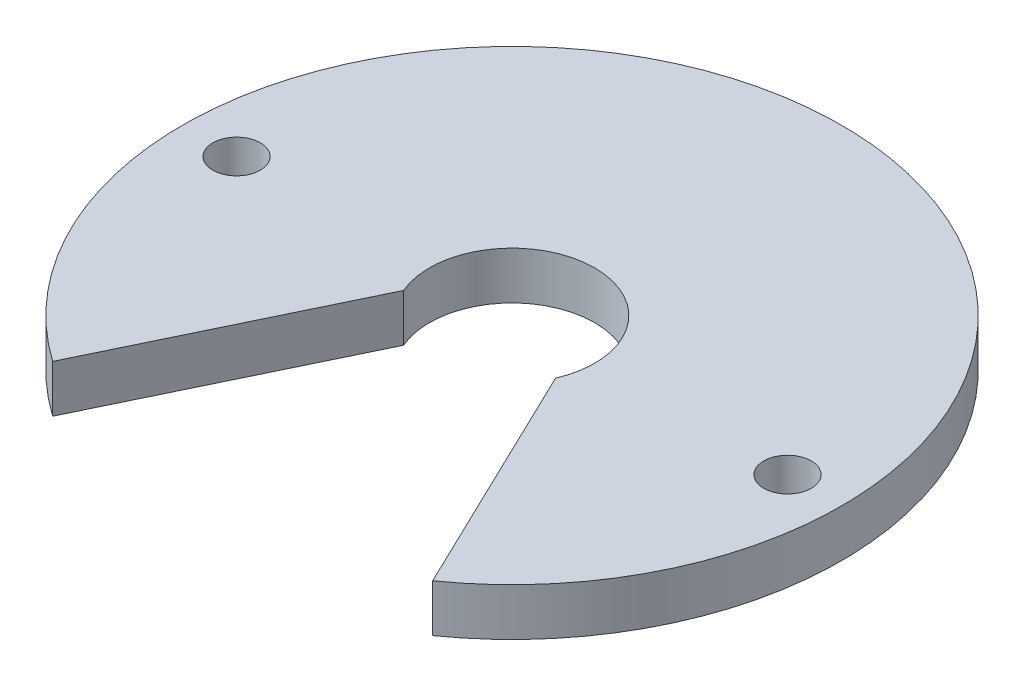
ISO-10303-21;
HEADER;
FILE_DESCRIPTION(('STEP AP214'),'2;1');
FILE_NAME('part.step','',(''),(''),'','','');
FILE_SCHEMA(('AUTOMOTIVE_DESIGN { 1 0 10303 214 1 1 1 1 }'));
ENDSEC;
DATA;
#1=APPLICATION_CONTEXT('core data for automotive mechanical design processes');
#2=APPLICATION_PROTOCOL_DEFINITION('international standard','automotive_design',2000,#1);
#3=PRODUCT_CONTEXT('',#1,'mechanical');
#4=PRODUCT('Part','Part','',(#3));
#5=PRODUCT_RELATED_PRODUCT_CATEGORY('part','',(#4));
#6=PRODUCT_DEFINITION_FORMATION('','',#4);
#7=PRODUCT_DEFINITION_CONTEXT('part definition',#1,'design');
#8=PRODUCT_DEFINITION('design','',#6,#7);
#9=PRODUCT_DEFINITION_SHAPE('','',#8);
#10=(LENGTH_UNIT() NAMED_UNIT(*) SI_UNIT(.MILLI.,.METRE.));
#11=(NAMED_UNIT(*) PLANE_ANGLE_UNIT() SI_UNIT($,.RADIAN.));
#12=(NAMED_UNIT(*) SI_UNIT($,.STERADIAN.) SOLID_ANGLE_UNIT());
#13=UNCERTAINTY_MEASURE_WITH_UNIT(LENGTH_MEASURE(1.E-05),#10,'distance_accuracy_value','');
#14=(GEOMETRIC_REPRESENTATION_CONTEXT(3) GLOBAL_UNCERTAINTY_ASSIGNED_CONTEXT((#13)) GLOBAL_UNIT_ASSIGNED_CONTEXT((#10,
#11,#12)) REPRESENTATION_CONTEXT('',''));
#15=CARTESIAN_POINT('',(0.,0.,0.));
#16=DIRECTION('',(0.,0.,1.));
#17=DIRECTION('',(1.,0.,0.));
#18=AXIS2_PLACEMENT_3D('',#15,#16,#17);
#19=CARTESIAN_POINT('',(0.,2.5,0.));
#20=DIRECTION('',(0.,-1.,0.));
#21=DIRECTION('',(0.,0.,-1.));
#22=AXIS2_PLACEMENT_3D('',#19,#20,#21);
#23=CYLINDRICAL_SURFACE('',#22,17.35);
#24=CARTESIAN_POINT('',(0.,2.5,0.));
#25=DIRECTION('',(0.,1.,0.));
#26=DIRECTION('',(0.,0.,1.));
#27=AXIS2_PLACEMENT_3D('',#24,#25,#26);
#28=CIRCLE('',#27,17.35);
#29=CARTESIAN_POINT('',(10.,2.5,14.1782403703704));
#30=VERTEX_POINT('',#29);
#31=CARTESIAN_POINT('',(-10.,2.5,14.1782403703704));
#32=VERTEX_POINT('',#31);
#33=EDGE_CURVE('E11',#30,#32,#28,.T.);
#34=ORIENTED_EDGE('',*,*,#33,.F.);
#35=DIRECTION('',(0.,1.,0.));
#36=VECTOR('',#35,1.);
#37=CARTESIAN_POINT('',(10.,0.,14.1782403703704));
#38=LINE('',#37,#36);
#39=CARTESIAN_POINT('',(10.,0.,14.1782403703704));
#40=VERTEX_POINT('',#39);
#41=EDGE_CURVE('E83',#40,#30,#38,.T.);
#42=ORIENTED_EDGE('',*,*,#41,.F.);
#43=CARTESIAN_POINT('',(0.,0.,0.));
#44=DIRECTION('',(0.,1.,0.));
#45=DIRECTION('',(0.,0.,1.));
#46=AXIS2_PLACEMENT_3D('',#43,#44,#45);
#47=CIRCLE('',#46,17.35);
#48=CARTESIAN_POINT('',(-10.,0.,14.1782403703704));
#49=VERTEX_POINT('',#48);
#50=EDGE_CURVE('E41',#40,#49,#47,.T.);
#51=ORIENTED_EDGE('',*,*,#50,.T.);
#52=DIRECTION('',(0.,1.,0.));
#53=VECTOR('',#52,1.);
#54=CARTESIAN_POINT('',(-10.,0.,14.1782403703704));
#55=LINE('',#54,#53);
#56=EDGE_CURVE('E76',#49,#32,#55,.T.);
#57=ORIENTED_EDGE('',*,*,#56,.T.);
#58=EDGE_LOOP('',(#34,#42,#51,#57));
#59=FACE_BOUND('',#58,.T.);
#60=ADVANCED_FACE('F38',(#59),#23,.T.);
#61=CARTESIAN_POINT('',(0.,2.5,0.));
#62=DIRECTION('',(0.,1.,0.));
#63=DIRECTION('',(0.,0.,1.));
#64=AXIS2_PLACEMENT_3D('',#61,#62,#63);
#65=PLANE('',#64);
#66=DIRECTION('',(-0.433613077751776,0.,-0.901099161470386));
#67=VECTOR('',#66,1.);
#68=CARTESIAN_POINT('',(4.,2.5,1.70953209972788));
#69=LINE('',#68,#67);
#70=CARTESIAN_POINT('',(4.,2.5,1.70953209972788));
#71=VERTEX_POINT('',#70);
#72=EDGE_CURVE('E52',#30,#71,#69,.T.);
#73=ORIENTED_EDGE('',*,*,#72,.F.);
#74=ORIENTED_EDGE('',*,*,#33,.T.);
#75=DIRECTION('',(-0.433613077751775,0.,0.901099161470386));
#76=VECTOR('',#75,1.);
#77=CARTESIAN_POINT('',(-4.,2.5,1.70953209972787));
#78=LINE('',#77,#76);
#79=CARTESIAN_POINT('',(-4.,2.5,1.70953209972787));
#80=VERTEX_POINT('',#79);
#81=EDGE_CURVE('E79',#80,#32,#78,.T.);
#82=ORIENTED_EDGE('',*,*,#81,.F.);
#83=CARTESIAN_POINT('',(0.,2.5,0.));
#84=DIRECTION('',(0.,1.,0.));
#85=DIRECTION('',(0.,0.,1.));
#86=AXIS2_PLACEMENT_3D('',#83,#84,#85);
#87=CIRCLE('',#86,4.35);
#88=EDGE_CURVE('E96',#71,#80,#87,.T.);
#89=ORIENTED_EDGE('',*,*,#88,.F.);
#90=EDGE_LOOP('',(#73,#74,#82,#89));
#91=FACE_BOUND('',#90,.T.);
#92=CARTESIAN_POINT('',(-14.5,2.5,0.));
#93=DIRECTION('',(0.,1.,0.));
#94=DIRECTION('',(0.,0.,1.));
#95=AXIS2_PLACEMENT_3D('',#92,#93,#94);
#96=CIRCLE('',#95,1.25);
#97=CARTESIAN_POINT('',(-14.5,2.5,1.25));
#98=VERTEX_POINT('',#97);
#99=EDGE_CURVE('E109',#98,#98,#96,.T.);
#100=ORIENTED_EDGE('',*,*,#99,.F.);
#101=EDGE_LOOP('',(#100));
#102=FACE_BOUND('',#101,.T.);
#103=CARTESIAN_POINT('',(14.5,2.5,0.));
#104=DIRECTION('',(0.,1.,0.));
#105=DIRECTION('',(0.,0.,1.));
#106=AXIS2_PLACEMENT_3D('',#103,#104,#105);
#107=CIRCLE('',#106,1.25);
#108=CARTESIAN_POINT('',(14.5,2.5,1.25));
#109=VERTEX_POINT('',#108);
#110=EDGE_CURVE('E105',#109,#109,#107,.T.);
#111=ORIENTED_EDGE('',*,*,#110,.F.);
#112=EDGE_LOOP('',(#111));
#113=FACE_BOUND('',#112,.T.);
#114=ADVANCED_FACE('F123',(#91,#102,#113),#65,.T.);
#115=CARTESIAN_POINT('',(0.,0.,0.));
#116=DIRECTION('',(0.,1.,0.));
#117=DIRECTION('',(0.,0.,1.));
#118=AXIS2_PLACEMENT_3D('',#115,#116,#117);
#119=PLANE('',#118);
#120=CARTESIAN_POINT('',(-14.5,0.,0.));
#121=DIRECTION('',(0.,1.,0.));
#122=DIRECTION('',(0.,0.,1.));
#123=AXIS2_PLACEMENT_3D('',#120,#121,#122);
#124=CIRCLE('',#123,1.25);
#125=CARTESIAN_POINT('',(-14.5,0.,1.25));
#126=VERTEX_POINT('',#125);
#127=EDGE_CURVE('E99',#126,#126,#124,.T.);
#128=ORIENTED_EDGE('',*,*,#127,.T.);
#129=EDGE_LOOP('',(#128));
#130=FACE_BOUND('',#129,.T.);
#131=CARTESIAN_POINT('',(14.5,0.,0.));
#132=DIRECTION('',(0.,1.,0.));
#133=DIRECTION('',(0.,0.,1.));
#134=AXIS2_PLACEMENT_3D('',#131,#132,#133);
#135=CIRCLE('',#134,1.25);
#136=CARTESIAN_POINT('',(14.5,0.,1.25));
#137=VERTEX_POINT('',#136);
#138=EDGE_CURVE('E102',#137,#137,#135,.T.);
#139=ORIENTED_EDGE('',*,*,#138,.T.);
#140=EDGE_LOOP('',(#139));
#141=FACE_BOUND('',#140,.T.);
#142=ORIENTED_EDGE('',*,*,#50,.F.);
#143=DIRECTION('',(-0.433613077751776,0.,-0.901099161470386));
#144=VECTOR('',#143,1.);
#145=CARTESIAN_POINT('',(4.,0.,1.70953209972788));
#146=LINE('',#145,#144);
#147=CARTESIAN_POINT('',(4.,0.,1.70953209972788));
#148=VERTEX_POINT('',#147);
#149=EDGE_CURVE('E93',#40,#148,#146,.T.);
#150=ORIENTED_EDGE('',*,*,#149,.T.);
#151=CARTESIAN_POINT('',(0.,0.,0.));
#152=DIRECTION('',(0.,1.,0.));
#153=DIRECTION('',(0.,0.,1.));
#154=AXIS2_PLACEMENT_3D('',#151,#152,#153);
#155=CIRCLE('',#154,4.35);
#156=CARTESIAN_POINT('',(-4.,0.,1.70953209972787));
#157=VERTEX_POINT('',#156);
#158=EDGE_CURVE('E92',#148,#157,#155,.T.);
#159=ORIENTED_EDGE('',*,*,#158,.T.);
#160=DIRECTION('',(-0.433613077751775,0.,0.901099161470386));
#161=VECTOR('',#160,1.);
#162=CARTESIAN_POINT('',(-4.,0.,1.70953209972787));
#163=LINE('',#162,#161);
#164=EDGE_CURVE('E60',#157,#49,#163,.T.);
#165=ORIENTED_EDGE('',*,*,#164,.T.);
#166=EDGE_LOOP('',(#142,#150,#159,#165));
#167=FACE_BOUND('',#166,.T.);
#168=ADVANCED_FACE('F89',(#130,#141,#167),#119,.F.);
#169=CARTESIAN_POINT('',(0.,0.,0.));
#170=DIRECTION('',(0.,1.,0.));
#171=DIRECTION('',(0.,0.,1.));
#172=AXIS2_PLACEMENT_3D('',#169,#170,#171);
#173=CYLINDRICAL_SURFACE('',#172,4.35);
#174=ORIENTED_EDGE('',*,*,#158,.F.);
#175=DIRECTION('',(0.,1.,0.));
#176=VECTOR('',#175,1.);
#177=CARTESIAN_POINT('',(4.,0.,1.70953209972788));
#178=LINE('',#177,#176);
#179=EDGE_CURVE('E106',#148,#71,#178,.T.);
#180=ORIENTED_EDGE('',*,*,#179,.T.);
#181=ORIENTED_EDGE('',*,*,#88,.T.);
#182=DIRECTION('',(0.,1.,0.));
#183=VECTOR('',#182,1.);
#184=CARTESIAN_POINT('',(-4.,0.,1.70953209972787));
#185=LINE('',#184,#183);
#186=EDGE_CURVE('E84',#157,#80,#185,.T.);
#187=ORIENTED_EDGE('',*,*,#186,.F.);
#188=EDGE_LOOP('',(#174,#180,#181,#187));
#189=FACE_BOUND('',#188,.T.);
#190=ADVANCED_FACE('F120',(#189),#173,.F.);
#191=CARTESIAN_POINT('',(14.5,0.,0.));
#192=DIRECTION('',(0.,1.,0.));
#193=DIRECTION('',(0.,0.,1.));
#194=AXIS2_PLACEMENT_3D('',#191,#192,#193);
#195=CYLINDRICAL_SURFACE('',#194,1.25);
#196=ORIENTED_EDGE('',*,*,#138,.F.);
#197=EDGE_LOOP('',(#196));
#198=FACE_BOUND('',#197,.T.);
#199=ORIENTED_EDGE('',*,*,#110,.T.);
#200=EDGE_LOOP('',(#199));
#201=FACE_BOUND('',#200,.T.);
#202=ADVANCED_FACE('F131',(#198,#201),#195,.F.);
#203=CARTESIAN_POINT('',(-14.5,0.,0.));
#204=DIRECTION('',(0.,1.,0.));
#205=DIRECTION('',(0.,0.,1.));
#206=AXIS2_PLACEMENT_3D('',#203,#204,#205);
#207=CYLINDRICAL_SURFACE('',#206,1.25);
#208=ORIENTED_EDGE('',*,*,#127,.F.);
#209=EDGE_LOOP('',(#208));
#210=FACE_BOUND('',#209,.T.);
#211=ORIENTED_EDGE('',*,*,#99,.T.);
#212=EDGE_LOOP('',(#211));
#213=FACE_BOUND('',#212,.T.);
#214=ADVANCED_FACE('F133',(#210,#213),#207,.F.);
#215=CARTESIAN_POINT('',(-4.,0.,1.70953209972787));
#216=DIRECTION('',(-0.901099161470386,0.,-0.433613077751775));
#217=DIRECTION('',(-0.433613077751775,0.,0.901099161470386));
#218=AXIS2_PLACEMENT_3D('',#215,#216,#217);
#219=PLANE('',#218);
#220=ORIENTED_EDGE('',*,*,#81,.T.);
#221=ORIENTED_EDGE('',*,*,#56,.F.);
#222=ORIENTED_EDGE('',*,*,#164,.F.);
#223=ORIENTED_EDGE('',*,*,#186,.T.);
#224=EDGE_LOOP('',(#220,#221,#222,#223));
#225=FACE_BOUND('',#224,.T.);
#226=ADVANCED_FACE('F77',(#225),#219,.F.);
#227=CARTESIAN_POINT('',(4.,0.,1.70953209972788));
#228=DIRECTION('',(0.901099161470385,0.,-0.433613077751776));
#229=DIRECTION('',(-0.433613077751776,0.,-0.901099161470385));
#230=AXIS2_PLACEMENT_3D('',#227,#228,#229);
#231=PLANE('',#230);
#232=ORIENTED_EDGE('',*,*,#72,.T.);
#233=ORIENTED_EDGE('',*,*,#179,.F.);
#234=ORIENTED_EDGE('',*,*,#149,.F.);
#235=ORIENTED_EDGE('',*,*,#41,.T.);
#236=EDGE_LOOP('',(#232,#233,#234,#235));
#237=FACE_BOUND('',#236,.T.);
#238=ADVANCED_FACE('F173',(#237),#231,.F.);
#239=CLOSED_SHELL('',(#60,#114,#168,#190,#202,#214,#226,#238));
#240=MANIFOLD_SOLID_BREP('B2',#239);
#241=ADVANCED_BREP_SHAPE_REPRESENTATION('',(#18,#240),#14);
#242=SHAPE_DEFINITION_REPRESENTATION(#9,#241);
ENDSEC;
END-ISO-10303-21;
